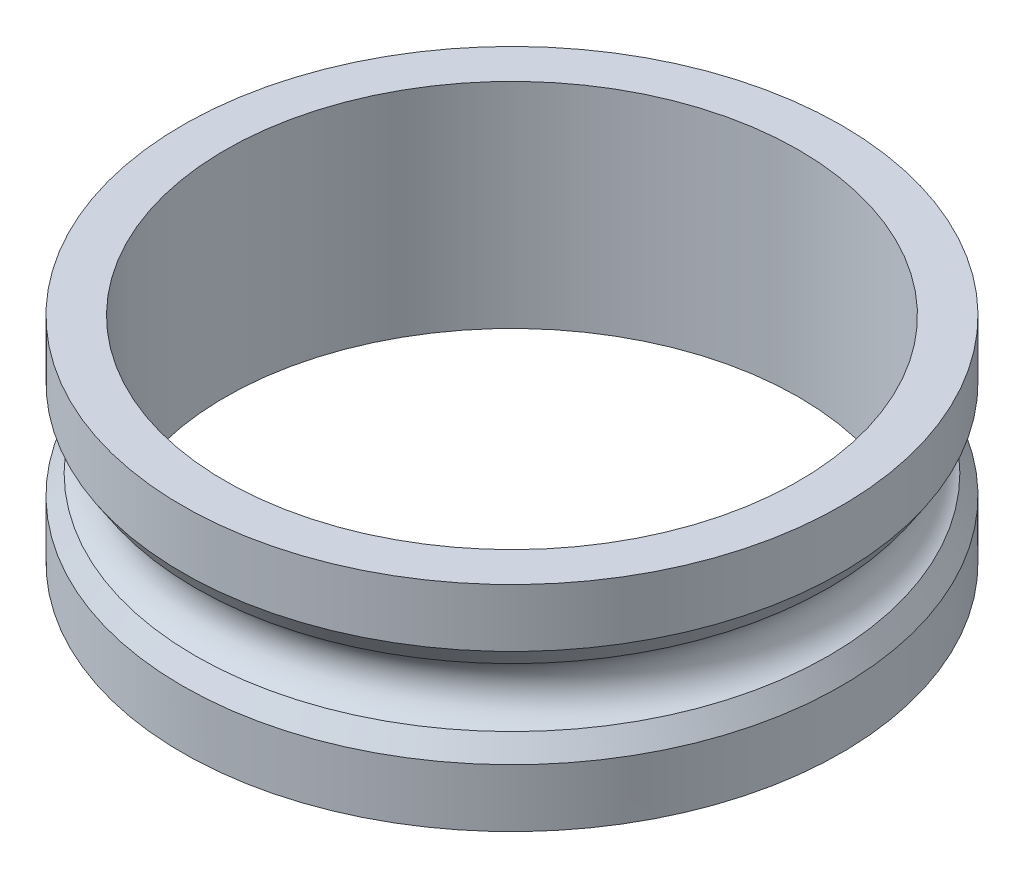
ISO-10303-21;
HEADER;
FILE_DESCRIPTION(('STEP AP214'),'2;1');
FILE_NAME('part.step','',(''),(''),'','','');
FILE_SCHEMA(('AUTOMOTIVE_DESIGN { 1 0 10303 214 1 1 1 1 }'));
ENDSEC;
DATA;
#1=APPLICATION_CONTEXT('core data for automotive mechanical design processes');
#2=APPLICATION_PROTOCOL_DEFINITION('international standard','automotive_design',2000,#1);
#3=PRODUCT_CONTEXT('',#1,'mechanical');
#4=PRODUCT('Part','Part','',(#3));
#5=PRODUCT_RELATED_PRODUCT_CATEGORY('part','',(#4));
#6=PRODUCT_DEFINITION_FORMATION('','',#4);
#7=PRODUCT_DEFINITION_CONTEXT('part definition',#1,'design');
#8=PRODUCT_DEFINITION('design','',#6,#7);
#9=PRODUCT_DEFINITION_SHAPE('','',#8);
#10=(LENGTH_UNIT() NAMED_UNIT(*) SI_UNIT(.MILLI.,.METRE.));
#11=(NAMED_UNIT(*) PLANE_ANGLE_UNIT() SI_UNIT($,.RADIAN.));
#12=(NAMED_UNIT(*) SI_UNIT($,.STERADIAN.) SOLID_ANGLE_UNIT());
#13=UNCERTAINTY_MEASURE_WITH_UNIT(LENGTH_MEASURE(1.E-05),#10,'distance_accuracy_value','');
#14=(GEOMETRIC_REPRESENTATION_CONTEXT(3) GLOBAL_UNCERTAINTY_ASSIGNED_CONTEXT((#13)) GLOBAL_UNIT_ASSIGNED_CONTEXT((#10,
#11,#12)) REPRESENTATION_CONTEXT('',''));
#15=CARTESIAN_POINT('',(0.,0.,0.));
#16=DIRECTION('',(0.,0.,1.));
#17=DIRECTION('',(1.,0.,0.));
#18=AXIS2_PLACEMENT_3D('',#15,#16,#17);
#19=CARTESIAN_POINT('',(6.7,-2.5,0.));
#20=DIRECTION('',(0.,-1.,0.));
#21=DIRECTION('',(0.,0.,-1.));
#22=AXIS2_PLACEMENT_3D('',#19,#20,#21);
#23=PLANE('',#22);
#24=CARTESIAN_POINT('',(0.,-2.5,0.));
#25=DIRECTION('',(0.,-1.,0.));
#26=DIRECTION('',(0.,0.,-1.));
#27=AXIS2_PLACEMENT_3D('',#24,#25,#26);
#28=CIRCLE('',#27,7.7);
#29=CARTESIAN_POINT('',(0.,-2.5,-7.7));
#30=VERTEX_POINT('',#29);
#31=EDGE_CURVE('E66',#30,#30,#28,.T.);
#32=ORIENTED_EDGE('',*,*,#31,.T.);
#33=EDGE_LOOP('',(#32));
#34=FACE_BOUND('',#33,.T.);
#35=CARTESIAN_POINT('',(0.,-2.5,0.));
#36=DIRECTION('',(0.,-1.,0.));
#37=DIRECTION('',(0.,0.,-1.));
#38=AXIS2_PLACEMENT_3D('',#35,#36,#37);
#39=CIRCLE('',#38,6.7);
#40=CARTESIAN_POINT('',(0.,-2.5,-6.7));
#41=VERTEX_POINT('',#40);
#42=EDGE_CURVE('E57',#41,#41,#39,.T.);
#43=ORIENTED_EDGE('',*,*,#42,.F.);
#44=EDGE_LOOP('',(#43));
#45=FACE_BOUND('',#44,.T.);
#46=ADVANCED_FACE('F36',(#34,#45),#23,.T.);
#47=CARTESIAN_POINT('',(0.,0.,0.));
#48=DIRECTION('',(0.,-1.,0.));
#49=DIRECTION('',(0.,0.,-1.));
#50=AXIS2_PLACEMENT_3D('',#47,#48,#49);
#51=CYLINDRICAL_SURFACE('',#50,6.7);
#52=ORIENTED_EDGE('',*,*,#42,.T.);
#53=EDGE_LOOP('',(#52));
#54=FACE_BOUND('',#53,.T.);
#55=CARTESIAN_POINT('',(0.,2.5,0.));
#56=DIRECTION('',(0.,-1.,0.));
#57=DIRECTION('',(0.,0.,-1.));
#58=AXIS2_PLACEMENT_3D('',#55,#56,#57);
#59=CIRCLE('',#58,6.7);
#60=CARTESIAN_POINT('',(0.,2.5,-6.7));
#61=VERTEX_POINT('',#60);
#62=EDGE_CURVE('E60',#61,#61,#59,.T.);
#63=ORIENTED_EDGE('',*,*,#62,.F.);
#64=EDGE_LOOP('',(#63));
#65=FACE_BOUND('',#64,.T.);
#66=ADVANCED_FACE('F86',(#54,#65),#51,.F.);
#67=CARTESIAN_POINT('',(6.7,2.5,0.));
#68=DIRECTION('',(0.,1.,0.));
#69=DIRECTION('',(0.,0.,1.));
#70=AXIS2_PLACEMENT_3D('',#67,#68,#69);
#71=PLANE('',#70);
#72=ORIENTED_EDGE('',*,*,#62,.T.);
#73=EDGE_LOOP('',(#72));
#74=FACE_BOUND('',#73,.T.);
#75=CARTESIAN_POINT('',(0.,2.5,0.));
#76=DIRECTION('',(0.,-1.,0.));
#77=DIRECTION('',(0.,0.,-1.));
#78=AXIS2_PLACEMENT_3D('',#75,#76,#77);
#79=CIRCLE('',#78,7.7);
#80=CARTESIAN_POINT('',(0.,2.5,-7.7));
#81=VERTEX_POINT('',#80);
#82=EDGE_CURVE('E63',#81,#81,#79,.T.);
#83=ORIENTED_EDGE('',*,*,#82,.F.);
#84=EDGE_LOOP('',(#83));
#85=FACE_BOUND('',#84,.T.);
#86=ADVANCED_FACE('F91',(#74,#85),#71,.T.);
#87=CARTESIAN_POINT('',(0.,0.,0.));
#88=DIRECTION('',(0.,-1.,0.));
#89=DIRECTION('',(0.,0.,-1.));
#90=AXIS2_PLACEMENT_3D('',#87,#88,#89);
#91=CYLINDRICAL_SURFACE('',#90,7.7);
#92=CARTESIAN_POINT('',(0.,1.14564392373896,0.));
#93=DIRECTION('',(0.,-1.,0.));
#94=DIRECTION('',(0.,0.,-1.));
#95=AXIS2_PLACEMENT_3D('',#92,#93,#94);
#96=CIRCLE('',#95,7.7);
#97=CARTESIAN_POINT('',(0.,1.14564392373896,-7.7));
#98=VERTEX_POINT('',#97);
#99=EDGE_CURVE('E10',#98,#98,#96,.F.);
#100=ORIENTED_EDGE('',*,*,#99,.T.);
#101=EDGE_LOOP('',(#100));
#102=FACE_BOUND('',#101,.T.);
#103=ORIENTED_EDGE('',*,*,#82,.T.);
#104=EDGE_LOOP('',(#103));
#105=FACE_BOUND('',#104,.T.);
#106=ADVANCED_FACE('F83',(#102,#105),#91,.T.);
#107=CARTESIAN_POINT('',(0.,0.,0.));
#108=DIRECTION('',(0.,-1.,0.));
#109=DIRECTION('',(0.,0.,-1.));
#110=AXIS2_PLACEMENT_3D('',#107,#108,#109);
#111=TOROIDAL_SURFACE('',#110,7.7,0.75);
#112=CARTESIAN_POINT('',(0.,-0.687386354243256,0.));
#113=DIRECTION('',(0.,1.,0.));
#114=DIRECTION('',(0.,0.,1.));
#115=AXIS2_PLACEMENT_3D('',#112,#113,#114);
#116=CIRCLE('',#115,7.40000000000005);
#117=CARTESIAN_POINT('',(0.,-0.687386354243256,7.40000000000005));
#118=VERTEX_POINT('',#117);
#119=EDGE_CURVE('E44',#118,#118,#116,.T.);
#120=ORIENTED_EDGE('',*,*,#119,.T.);
#121=EDGE_LOOP('',(#120));
#122=FACE_BOUND('',#121,.T.);
#123=CARTESIAN_POINT('',(0.,0.687386354243335,0.));
#124=DIRECTION('',(0.,-1.,0.));
#125=DIRECTION('',(0.,0.,-1.));
#126=AXIS2_PLACEMENT_3D('',#123,#124,#125);
#127=CIRCLE('',#126,7.40000000000001);
#128=CARTESIAN_POINT('',(0.,0.687386354243335,-7.40000000000001));
#129=VERTEX_POINT('',#128);
#130=EDGE_CURVE('E48',#129,#129,#127,.T.);
#131=ORIENTED_EDGE('',*,*,#130,.T.);
#132=EDGE_LOOP('',(#131));
#133=FACE_BOUND('',#132,.T.);
#134=ADVANCED_FACE('F75',(#122,#133),#111,.F.);
#135=CARTESIAN_POINT('',(0.,0.,0.));
#136=DIRECTION('',(0.,-1.,0.));
#137=DIRECTION('',(0.,0.,-1.));
#138=AXIS2_PLACEMENT_3D('',#135,#136,#137);
#139=CYLINDRICAL_SURFACE('',#138,7.7);
#140=CARTESIAN_POINT('',(0.,-1.14564392373897,0.));
#141=DIRECTION('',(0.,1.,0.));
#142=DIRECTION('',(0.,0.,1.));
#143=AXIS2_PLACEMENT_3D('',#140,#141,#142);
#144=CIRCLE('',#143,7.7);
#145=CARTESIAN_POINT('',(0.,-1.14564392373897,7.7));
#146=VERTEX_POINT('',#145);
#147=EDGE_CURVE('E52',#146,#146,#144,.F.);
#148=ORIENTED_EDGE('',*,*,#147,.T.);
#149=EDGE_LOOP('',(#148));
#150=FACE_BOUND('',#149,.T.);
#151=ORIENTED_EDGE('',*,*,#31,.F.);
#152=EDGE_LOOP('',(#151));
#153=FACE_BOUND('',#152,.T.);
#154=ADVANCED_FACE('F72',(#150,#153),#139,.T.);
#155=CARTESIAN_POINT('',(0.,-1.14564392373897,0.));
#156=DIRECTION('',(0.,-1.,0.));
#157=DIRECTION('',(0.,0.,-1.));
#158=AXIS2_PLACEMENT_3D('',#155,#156,#157);
#159=CONICAL_SURFACE('',#158,7.7,0.57963974036369);
#160=ORIENTED_EDGE('',*,*,#119,.F.);
#161=EDGE_LOOP('',(#160));
#162=FACE_BOUND('',#161,.T.);
#163=ORIENTED_EDGE('',*,*,#147,.F.);
#164=EDGE_LOOP('',(#163));
#165=FACE_BOUND('',#164,.T.);
#166=ADVANCED_FACE('F74',(#162,#165),#159,.T.);
#167=CARTESIAN_POINT('',(0.,0.687386354243373,0.));
#168=DIRECTION('',(0.,1.,0.));
#169=DIRECTION('',(0.,0.,1.));
#170=AXIS2_PLACEMENT_3D('',#167,#168,#169);
#171=CONICAL_SURFACE('',#170,7.39999999999999,0.579639740363707);
#172=ORIENTED_EDGE('',*,*,#99,.F.);
#173=EDGE_LOOP('',(#172));
#174=FACE_BOUND('',#173,.T.);
#175=ORIENTED_EDGE('',*,*,#130,.F.);
#176=EDGE_LOOP('',(#175));
#177=FACE_BOUND('',#176,.T.);
#178=ADVANCED_FACE('F39',(#174,#177),#171,.T.);
#179=CLOSED_SHELL('',(#46,#66,#86,#106,#134,#154,#166,#178));
#180=MANIFOLD_SOLID_BREP('B2',#179);
#181=ADVANCED_BREP_SHAPE_REPRESENTATION('',(#18,#180),#14);
#182=SHAPE_DEFINITION_REPRESENTATION(#9,#181);
ENDSEC;
END-ISO-10303-21;
